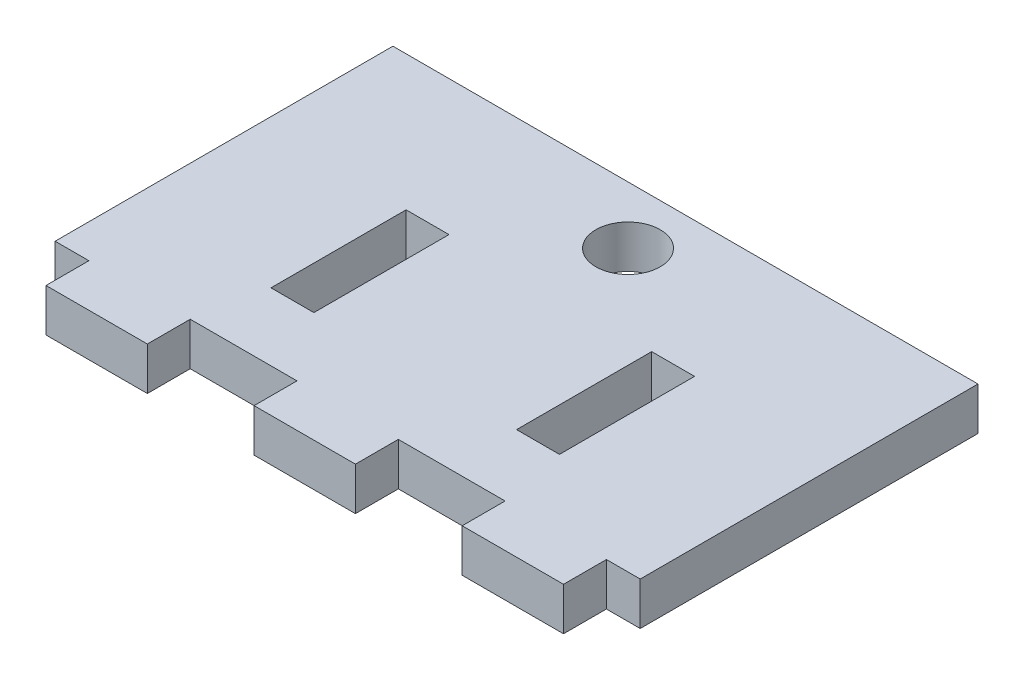
ISO-10303-21;
HEADER;
FILE_DESCRIPTION(('STEP AP214'),'2;1');
FILE_NAME('part.step','',(''),(''),'','','');
FILE_SCHEMA(('AUTOMOTIVE_DESIGN { 1 0 10303 214 1 1 1 1 }'));
ENDSEC;
DATA;
#1=APPLICATION_CONTEXT('core data for automotive mechanical design processes');
#2=APPLICATION_PROTOCOL_DEFINITION('international standard','automotive_design',2000,#1);
#3=PRODUCT_CONTEXT('',#1,'mechanical');
#4=PRODUCT('Part','Part','',(#3));
#5=PRODUCT_RELATED_PRODUCT_CATEGORY('part','',(#4));
#6=PRODUCT_DEFINITION_FORMATION('','',#4);
#7=PRODUCT_DEFINITION_CONTEXT('part definition',#1,'design');
#8=PRODUCT_DEFINITION('design','',#6,#7);
#9=PRODUCT_DEFINITION_SHAPE('','',#8);
#10=(LENGTH_UNIT() NAMED_UNIT(*) SI_UNIT(.MILLI.,.METRE.));
#11=(NAMED_UNIT(*) PLANE_ANGLE_UNIT() SI_UNIT($,.RADIAN.));
#12=(NAMED_UNIT(*) SI_UNIT($,.STERADIAN.) SOLID_ANGLE_UNIT());
#13=UNCERTAINTY_MEASURE_WITH_UNIT(LENGTH_MEASURE(1.E-05),#10,'distance_accuracy_value','');
#14=(GEOMETRIC_REPRESENTATION_CONTEXT(3) GLOBAL_UNCERTAINTY_ASSIGNED_CONTEXT((#13)) GLOBAL_UNIT_ASSIGNED_CONTEXT((#10,
#11,#12)) REPRESENTATION_CONTEXT('',''));
#15=CARTESIAN_POINT('',(0.,0.,0.));
#16=DIRECTION('',(0.,0.,1.));
#17=DIRECTION('',(1.,0.,0.));
#18=AXIS2_PLACEMENT_3D('',#15,#16,#17);
#19=CARTESIAN_POINT('',(-43.3012701892221,6.35,25.));
#20=DIRECTION('',(0.,0.,-1.));
#21=DIRECTION('',(-1.,0.,0.));
#22=AXIS2_PLACEMENT_3D('',#19,#20,#21);
#23=PLANE('',#22);
#24=DIRECTION('',(0.,1.,0.));
#25=VECTOR('',#24,1.);
#26=CARTESIAN_POINT('',(7.5,0.,25.));
#27=LINE('',#26,#25);
#28=CARTESIAN_POINT('',(7.5,0.,25.));
#29=VERTEX_POINT('',#28);
#30=CARTESIAN_POINT('',(7.5,6.35,25.));
#31=VERTEX_POINT('',#30);
#32=EDGE_CURVE('E246',#29,#31,#27,.T.);
#33=ORIENTED_EDGE('',*,*,#32,.F.);
#34=DIRECTION('',(1.,0.,0.));
#35=VECTOR('',#34,1.);
#36=CARTESIAN_POINT('',(-43.3012701892221,0.,25.));
#37=LINE('',#36,#35);
#38=CARTESIAN_POINT('',(23.3012701892221,0.,25.));
#39=VERTEX_POINT('',#38);
#40=EDGE_CURVE('E388',#29,#39,#37,.T.);
#41=ORIENTED_EDGE('',*,*,#40,.T.);
#42=DIRECTION('',(0.,-1.,0.));
#43=VECTOR('',#42,1.);
#44=CARTESIAN_POINT('',(23.3012701892221,0.,25.));
#45=LINE('',#44,#43);
#46=CARTESIAN_POINT('',(23.3012701892221,6.35,25.));
#47=VERTEX_POINT('',#46);
#48=EDGE_CURVE('E337',#47,#39,#45,.T.);
#49=ORIENTED_EDGE('',*,*,#48,.F.);
#50=DIRECTION('',(1.,0.,0.));
#51=VECTOR('',#50,1.);
#52=CARTESIAN_POINT('',(-43.3012701892221,6.35,25.));
#53=LINE('',#52,#51);
#54=EDGE_CURVE('E376',#31,#47,#53,.T.);
#55=ORIENTED_EDGE('',*,*,#54,.F.);
#56=EDGE_LOOP('',(#33,#41,#49,#55));
#57=FACE_BOUND('',#56,.T.);
#58=ADVANCED_FACE('F47',(#57),#23,.F.);
#59=DIRECTION('',(0.,-1.,0.));
#60=VECTOR('',#59,1.);
#61=CARTESIAN_POINT('',(-7.5,0.,25.));
#62=LINE('',#61,#60);
#63=CARTESIAN_POINT('',(-7.5,6.35,25.));
#64=VERTEX_POINT('',#63);
#65=CARTESIAN_POINT('',(-7.5,0.,25.));
#66=VERTEX_POINT('',#65);
#67=EDGE_CURVE('E283',#64,#66,#62,.T.);
#68=ORIENTED_EDGE('',*,*,#67,.F.);
#69=CARTESIAN_POINT('',(-23.3012701892221,6.35,25.));
#70=VERTEX_POINT('',#69);
#71=EDGE_CURVE('E375',#70,#64,#53,.T.);
#72=ORIENTED_EDGE('',*,*,#71,.F.);
#73=DIRECTION('',(0.,1.,0.));
#74=VECTOR('',#73,1.);
#75=CARTESIAN_POINT('',(-23.3012701892221,0.,25.));
#76=LINE('',#75,#74);
#77=CARTESIAN_POINT('',(-23.3012701892221,0.,25.));
#78=VERTEX_POINT('',#77);
#79=EDGE_CURVE('E310',#78,#70,#76,.T.);
#80=ORIENTED_EDGE('',*,*,#79,.F.);
#81=EDGE_CURVE('E387',#78,#66,#37,.T.);
#82=ORIENTED_EDGE('',*,*,#81,.T.);
#83=EDGE_LOOP('',(#68,#72,#80,#82));
#84=FACE_BOUND('',#83,.T.);
#85=ADVANCED_FACE('F452',(#84),#23,.F.);
#86=DIRECTION('',(0.,-1.,0.));
#87=VECTOR('',#86,1.);
#88=CARTESIAN_POINT('',(-38.3012701892221,0.,25.));
#89=LINE('',#88,#87);
#90=CARTESIAN_POINT('',(-38.3012701892221,6.35,25.));
#91=VERTEX_POINT('',#90);
#92=CARTESIAN_POINT('',(-38.3012701892221,0.,25.));
#93=VERTEX_POINT('',#92);
#94=EDGE_CURVE('E305',#91,#93,#89,.T.);
#95=ORIENTED_EDGE('',*,*,#94,.F.);
#96=CARTESIAN_POINT('',(-43.3012701892221,6.35,25.));
#97=VERTEX_POINT('',#96);
#98=EDGE_CURVE('E371',#97,#91,#53,.T.);
#99=ORIENTED_EDGE('',*,*,#98,.F.);
#100=DIRECTION('',(0.,-1.,0.));
#101=VECTOR('',#100,1.);
#102=CARTESIAN_POINT('',(-43.3012701892221,6.35,25.));
#103=LINE('',#102,#101);
#104=CARTESIAN_POINT('',(-43.3012701892221,0.,25.));
#105=VERTEX_POINT('',#104);
#106=EDGE_CURVE('E13',#97,#105,#103,.T.);
#107=ORIENTED_EDGE('',*,*,#106,.T.);
#108=EDGE_CURVE('E384',#105,#93,#37,.T.);
#109=ORIENTED_EDGE('',*,*,#108,.T.);
#110=EDGE_LOOP('',(#95,#99,#107,#109));
#111=FACE_BOUND('',#110,.T.);
#112=ADVANCED_FACE('F464',(#111),#23,.F.);
#113=DIRECTION('',(0.,1.,0.));
#114=VECTOR('',#113,1.);
#115=CARTESIAN_POINT('',(38.3012701892221,0.,25.));
#116=LINE('',#115,#114);
#117=CARTESIAN_POINT('',(38.3012701892221,0.,25.));
#118=VERTEX_POINT('',#117);
#119=CARTESIAN_POINT('',(38.3012701892221,6.35,25.));
#120=VERTEX_POINT('',#119);
#121=EDGE_CURVE('E332',#118,#120,#116,.T.);
#122=ORIENTED_EDGE('',*,*,#121,.F.);
#123=CARTESIAN_POINT('',(43.3012701892221,0.,25.));
#124=VERTEX_POINT('',#123);
#125=EDGE_CURVE('E383',#118,#124,#37,.T.);
#126=ORIENTED_EDGE('',*,*,#125,.T.);
#127=DIRECTION('',(0.,-1.,0.));
#128=VECTOR('',#127,1.);
#129=CARTESIAN_POINT('',(43.3012701892221,6.35,25.));
#130=LINE('',#129,#128);
#131=CARTESIAN_POINT('',(43.3012701892221,6.35,25.));
#132=VERTEX_POINT('',#131);
#133=EDGE_CURVE('E55',#132,#124,#130,.T.);
#134=ORIENTED_EDGE('',*,*,#133,.F.);
#135=EDGE_CURVE('E369',#120,#132,#53,.T.);
#136=ORIENTED_EDGE('',*,*,#135,.F.);
#137=EDGE_LOOP('',(#122,#126,#134,#136));
#138=FACE_BOUND('',#137,.T.);
#139=ADVANCED_FACE('F451',(#138),#23,.F.);
#140=CARTESIAN_POINT('',(-43.3012701892221,6.35,-25.));
#141=DIRECTION('',(1.,0.,0.));
#142=DIRECTION('',(0.,0.,-1.));
#143=AXIS2_PLACEMENT_3D('',#140,#141,#142);
#144=PLANE('',#143);
#145=DIRECTION('',(0.,0.,1.));
#146=VECTOR('',#145,1.);
#147=CARTESIAN_POINT('',(-43.3012701892221,0.,-25.));
#148=LINE('',#147,#146);
#149=CARTESIAN_POINT('',(-43.3012701892221,0.,-25.));
#150=VERTEX_POINT('',#149);
#151=EDGE_CURVE('E365',#150,#105,#148,.T.);
#152=ORIENTED_EDGE('',*,*,#151,.T.);
#153=ORIENTED_EDGE('',*,*,#106,.F.);
#154=DIRECTION('',(0.,0.,1.));
#155=VECTOR('',#154,1.);
#156=CARTESIAN_POINT('',(-43.3012701892221,6.35,-25.));
#157=LINE('',#156,#155);
#158=CARTESIAN_POINT('',(-43.3012701892221,6.35,-25.));
#159=VERTEX_POINT('',#158);
#160=EDGE_CURVE('E366',#159,#97,#157,.T.);
#161=ORIENTED_EDGE('',*,*,#160,.F.);
#162=DIRECTION('',(0.,-1.,0.));
#163=VECTOR('',#162,1.);
#164=CARTESIAN_POINT('',(-43.3012701892221,6.35,-25.));
#165=LINE('',#164,#163);
#166=EDGE_CURVE('E380',#159,#150,#165,.T.);
#167=ORIENTED_EDGE('',*,*,#166,.T.);
#168=EDGE_LOOP('',(#152,#153,#161,#167));
#169=FACE_BOUND('',#168,.T.);
#170=ADVANCED_FACE('F49',(#169),#144,.F.);
#171=CARTESIAN_POINT('',(43.3012701892221,6.35,-25.));
#172=DIRECTION('',(-1.,0.,0.));
#173=DIRECTION('',(0.,0.,1.));
#174=AXIS2_PLACEMENT_3D('',#171,#172,#173);
#175=PLANE('',#174);
#176=DIRECTION('',(0.,0.,-1.));
#177=VECTOR('',#176,1.);
#178=CARTESIAN_POINT('',(43.3012701892221,0.,-25.));
#179=LINE('',#178,#177);
#180=CARTESIAN_POINT('',(43.3012701892221,0.,-25.));
#181=VERTEX_POINT('',#180);
#182=EDGE_CURVE('E386',#124,#181,#179,.T.);
#183=ORIENTED_EDGE('',*,*,#182,.T.);
#184=DIRECTION('',(0.,-1.,0.));
#185=VECTOR('',#184,1.);
#186=CARTESIAN_POINT('',(43.3012701892221,6.35,-25.));
#187=LINE('',#186,#185);
#188=CARTESIAN_POINT('',(43.3012701892221,6.35,-25.));
#189=VERTEX_POINT('',#188);
#190=EDGE_CURVE('E393',#189,#181,#187,.T.);
#191=ORIENTED_EDGE('',*,*,#190,.F.);
#192=DIRECTION('',(0.,0.,-1.));
#193=VECTOR('',#192,1.);
#194=CARTESIAN_POINT('',(43.3012701892221,6.35,-25.));
#195=LINE('',#194,#193);
#196=EDGE_CURVE('E374',#132,#189,#195,.T.);
#197=ORIENTED_EDGE('',*,*,#196,.F.);
#198=ORIENTED_EDGE('',*,*,#133,.T.);
#199=EDGE_LOOP('',(#183,#191,#197,#198));
#200=FACE_BOUND('',#199,.T.);
#201=ADVANCED_FACE('F400',(#200),#175,.F.);
#202=CARTESIAN_POINT('',(-43.3012701892221,6.35,-25.));
#203=DIRECTION('',(0.,0.,1.));
#204=DIRECTION('',(1.,0.,0.));
#205=AXIS2_PLACEMENT_3D('',#202,#203,#204);
#206=PLANE('',#205);
#207=DIRECTION('',(-1.,0.,0.));
#208=VECTOR('',#207,1.);
#209=CARTESIAN_POINT('',(-43.3012701892221,0.,-25.));
#210=LINE('',#209,#208);
#211=EDGE_CURVE('E370',#181,#150,#210,.T.);
#212=ORIENTED_EDGE('',*,*,#211,.T.);
#213=ORIENTED_EDGE('',*,*,#166,.F.);
#214=DIRECTION('',(-1.,0.,0.));
#215=VECTOR('',#214,1.);
#216=CARTESIAN_POINT('',(-43.3012701892221,6.35,-25.));
#217=LINE('',#216,#215);
#218=EDGE_CURVE('E378',#189,#159,#217,.T.);
#219=ORIENTED_EDGE('',*,*,#218,.F.);
#220=ORIENTED_EDGE('',*,*,#190,.T.);
#221=EDGE_LOOP('',(#212,#213,#219,#220));
#222=FACE_BOUND('',#221,.T.);
#223=ADVANCED_FACE('F411',(#222),#206,.F.);
#224=CARTESIAN_POINT('',(0.,6.35,0.));
#225=DIRECTION('',(0.,1.,0.));
#226=DIRECTION('',(0.,0.,1.));
#227=AXIS2_PLACEMENT_3D('',#224,#225,#226);
#228=PLANE('',#227);
#229=DIRECTION('',(0.,0.,1.));
#230=VECTOR('',#229,1.);
#231=CARTESIAN_POINT('',(21.35,6.35,-5.00000000000002));
#232=LINE('',#231,#230);
#233=CARTESIAN_POINT('',(21.35,6.35,-5.00000000000002));
#234=VERTEX_POINT('',#233);
#235=CARTESIAN_POINT('',(21.35,6.35,15.));
#236=VERTEX_POINT('',#235);
#237=EDGE_CURVE('E212',#234,#236,#232,.T.);
#238=ORIENTED_EDGE('',*,*,#237,.T.);
#239=DIRECTION('',(-1.,0.,0.));
#240=VECTOR('',#239,1.);
#241=CARTESIAN_POINT('',(21.35,6.35,15.));
#242=LINE('',#241,#240);
#243=CARTESIAN_POINT('',(15.,6.35,15.));
#244=VERTEX_POINT('',#243);
#245=EDGE_CURVE('E223',#236,#244,#242,.T.);
#246=ORIENTED_EDGE('',*,*,#245,.T.);
#247=DIRECTION('',(0.,0.,-1.));
#248=VECTOR('',#247,1.);
#249=CARTESIAN_POINT('',(15.,6.35,-5.00000000000002));
#250=LINE('',#249,#248);
#251=CARTESIAN_POINT('',(15.,6.35,-5.00000000000002));
#252=VERTEX_POINT('',#251);
#253=EDGE_CURVE('E62',#244,#252,#250,.T.);
#254=ORIENTED_EDGE('',*,*,#253,.T.);
#255=DIRECTION('',(1.,0.,0.));
#256=VECTOR('',#255,1.);
#257=CARTESIAN_POINT('',(21.35,6.35,-5.00000000000002));
#258=LINE('',#257,#256);
#259=EDGE_CURVE('E220',#252,#234,#258,.T.);
#260=ORIENTED_EDGE('',*,*,#259,.T.);
#261=EDGE_LOOP('',(#238,#246,#254,#260));
#262=FACE_BOUND('',#261,.T.);
#263=DIRECTION('',(0.,0.,-1.));
#264=VECTOR('',#263,1.);
#265=CARTESIAN_POINT('',(-21.35,6.35,-5.00000000000002));
#266=LINE('',#265,#264);
#267=CARTESIAN_POINT('',(-21.35,6.35,15.));
#268=VERTEX_POINT('',#267);
#269=CARTESIAN_POINT('',(-21.35,6.35,-5.00000000000002));
#270=VERTEX_POINT('',#269);
#271=EDGE_CURVE('E250',#268,#270,#266,.T.);
#272=ORIENTED_EDGE('',*,*,#271,.T.);
#273=DIRECTION('',(1.,0.,0.));
#274=VECTOR('',#273,1.);
#275=CARTESIAN_POINT('',(-21.35,6.35,-5.00000000000002));
#276=LINE('',#275,#274);
#277=CARTESIAN_POINT('',(-15.,6.35,-5.00000000000002));
#278=VERTEX_POINT('',#277);
#279=EDGE_CURVE('E253',#270,#278,#276,.T.);
#280=ORIENTED_EDGE('',*,*,#279,.T.);
#281=DIRECTION('',(0.,0.,1.));
#282=VECTOR('',#281,1.);
#283=CARTESIAN_POINT('',(-15.,6.35,-5.00000000000002));
#284=LINE('',#283,#282);
#285=CARTESIAN_POINT('',(-15.,6.35,15.));
#286=VERTEX_POINT('',#285);
#287=EDGE_CURVE('E70',#278,#286,#284,.T.);
#288=ORIENTED_EDGE('',*,*,#287,.T.);
#289=DIRECTION('',(-1.,0.,0.));
#290=VECTOR('',#289,1.);
#291=CARTESIAN_POINT('',(-21.35,6.35,15.));
#292=LINE('',#291,#290);
#293=EDGE_CURVE('E258',#286,#268,#292,.T.);
#294=ORIENTED_EDGE('',*,*,#293,.T.);
#295=EDGE_LOOP('',(#272,#280,#288,#294));
#296=FACE_BOUND('',#295,.T.);
#297=CARTESIAN_POINT('',(0.,6.35,-16.5));
#298=DIRECTION('',(0.,1.,0.));
#299=DIRECTION('',(0.,0.,1.));
#300=AXIS2_PLACEMENT_3D('',#297,#298,#299);
#301=CIRCLE('',#300,4.7625);
#302=CARTESIAN_POINT('',(0.,6.35,-11.7375));
#303=VERTEX_POINT('',#302);
#304=EDGE_CURVE('E359',#303,#303,#301,.T.);
#305=ORIENTED_EDGE('',*,*,#304,.F.);
#306=EDGE_LOOP('',(#305));
#307=FACE_BOUND('',#306,.T.);
#308=ORIENTED_EDGE('',*,*,#160,.T.);
#309=ORIENTED_EDGE('',*,*,#98,.T.);
#310=DIRECTION('',(0.,0.,-1.));
#311=VECTOR('',#310,1.);
#312=CARTESIAN_POINT('',(-38.3012701892221,6.35,31.35));
#313=LINE('',#312,#311);
#314=CARTESIAN_POINT('',(-38.3012701892221,6.35,31.35));
#315=VERTEX_POINT('',#314);
#316=EDGE_CURVE('E316',#315,#91,#313,.T.);
#317=ORIENTED_EDGE('',*,*,#316,.F.);
#318=DIRECTION('',(-1.,0.,0.));
#319=VECTOR('',#318,1.);
#320=CARTESIAN_POINT('',(-38.3012701892221,6.35,31.35));
#321=LINE('',#320,#319);
#322=CARTESIAN_POINT('',(-23.3012701892221,6.35,31.35));
#323=VERTEX_POINT('',#322);
#324=EDGE_CURVE('E314',#323,#315,#321,.T.);
#325=ORIENTED_EDGE('',*,*,#324,.F.);
#326=DIRECTION('',(0.,0.,-1.));
#327=VECTOR('',#326,1.);
#328=CARTESIAN_POINT('',(-23.3012701892221,6.35,31.35));
#329=LINE('',#328,#327);
#330=EDGE_CURVE('E323',#323,#70,#329,.T.);
#331=ORIENTED_EDGE('',*,*,#330,.T.);
#332=ORIENTED_EDGE('',*,*,#71,.T.);
#333=DIRECTION('',(0.,0.,-1.));
#334=VECTOR('',#333,1.);
#335=CARTESIAN_POINT('',(-7.5,6.35,31.35));
#336=LINE('',#335,#334);
#337=CARTESIAN_POINT('',(-7.5,6.35,31.35));
#338=VERTEX_POINT('',#337);
#339=EDGE_CURVE('E299',#338,#64,#336,.T.);
#340=ORIENTED_EDGE('',*,*,#339,.F.);
#341=DIRECTION('',(-1.,0.,0.));
#342=VECTOR('',#341,1.);
#343=CARTESIAN_POINT('',(7.5,6.35,31.35));
#344=LINE('',#343,#342);
#345=CARTESIAN_POINT('',(7.5,6.35,31.35));
#346=VERTEX_POINT('',#345);
#347=EDGE_CURVE('E282',#346,#338,#344,.T.);
#348=ORIENTED_EDGE('',*,*,#347,.F.);
#349=DIRECTION('',(0.,0.,-1.));
#350=VECTOR('',#349,1.);
#351=CARTESIAN_POINT('',(7.5,6.35,31.35));
#352=LINE('',#351,#350);
#353=EDGE_CURVE('E302',#346,#31,#352,.T.);
#354=ORIENTED_EDGE('',*,*,#353,.T.);
#355=ORIENTED_EDGE('',*,*,#54,.T.);
#356=DIRECTION('',(0.,0.,-1.));
#357=VECTOR('',#356,1.);
#358=CARTESIAN_POINT('',(23.3012701892221,6.35,31.35));
#359=LINE('',#358,#357);
#360=CARTESIAN_POINT('',(23.3012701892221,6.35,31.35));
#361=VERTEX_POINT('',#360);
#362=EDGE_CURVE('E353',#361,#47,#359,.T.);
#363=ORIENTED_EDGE('',*,*,#362,.F.);
#364=DIRECTION('',(-1.,0.,0.));
#365=VECTOR('',#364,1.);
#366=CARTESIAN_POINT('',(38.3012701892221,6.35,31.35));
#367=LINE('',#366,#365);
#368=CARTESIAN_POINT('',(38.3012701892221,6.35,31.35));
#369=VERTEX_POINT('',#368);
#370=EDGE_CURVE('E336',#369,#361,#367,.T.);
#371=ORIENTED_EDGE('',*,*,#370,.F.);
#372=DIRECTION('',(0.,0.,-1.));
#373=VECTOR('',#372,1.);
#374=CARTESIAN_POINT('',(38.3012701892221,6.35,31.35));
#375=LINE('',#374,#373);
#376=EDGE_CURVE('E356',#369,#120,#375,.T.);
#377=ORIENTED_EDGE('',*,*,#376,.T.);
#378=ORIENTED_EDGE('',*,*,#135,.T.);
#379=ORIENTED_EDGE('',*,*,#196,.T.);
#380=ORIENTED_EDGE('',*,*,#218,.T.);
#381=EDGE_LOOP('',(#308,#309,#317,#325,#331,#332,#340,#348,#354,#355,#363,#371,#377,#378,#379,#380));
#382=FACE_BOUND('',#381,.T.);
#383=ADVANCED_FACE('F227',(#262,#296,#307,#382),#228,.T.);
#384=CARTESIAN_POINT('',(0.,0.,0.));
#385=DIRECTION('',(0.,1.,0.));
#386=DIRECTION('',(0.,0.,1.));
#387=AXIS2_PLACEMENT_3D('',#384,#385,#386);
#388=PLANE('',#387);
#389=DIRECTION('',(-1.,0.,0.));
#390=VECTOR('',#389,1.);
#391=CARTESIAN_POINT('',(21.35,0.,15.));
#392=LINE('',#391,#390);
#393=CARTESIAN_POINT('',(21.35,0.,15.));
#394=VERTEX_POINT('',#393);
#395=CARTESIAN_POINT('',(15.,0.,15.));
#396=VERTEX_POINT('',#395);
#397=EDGE_CURVE('E239',#394,#396,#392,.T.);
#398=ORIENTED_EDGE('',*,*,#397,.F.);
#399=DIRECTION('',(0.,0.,1.));
#400=VECTOR('',#399,1.);
#401=CARTESIAN_POINT('',(21.35,0.,-5.00000000000002));
#402=LINE('',#401,#400);
#403=CARTESIAN_POINT('',(21.35,0.,-5.00000000000002));
#404=VERTEX_POINT('',#403);
#405=EDGE_CURVE('E215',#404,#394,#402,.T.);
#406=ORIENTED_EDGE('',*,*,#405,.F.);
#407=DIRECTION('',(1.,0.,0.));
#408=VECTOR('',#407,1.);
#409=CARTESIAN_POINT('',(21.35,0.,-5.00000000000002));
#410=LINE('',#409,#408);
#411=CARTESIAN_POINT('',(15.,0.,-5.00000000000002));
#412=VERTEX_POINT('',#411);
#413=EDGE_CURVE('E230',#412,#404,#410,.T.);
#414=ORIENTED_EDGE('',*,*,#413,.F.);
#415=DIRECTION('',(0.,0.,-1.));
#416=VECTOR('',#415,1.);
#417=CARTESIAN_POINT('',(15.,0.,-5.00000000000002));
#418=LINE('',#417,#416);
#419=EDGE_CURVE('E233',#396,#412,#418,.T.);
#420=ORIENTED_EDGE('',*,*,#419,.F.);
#421=EDGE_LOOP('',(#398,#406,#414,#420));
#422=FACE_BOUND('',#421,.T.);
#423=DIRECTION('',(1.,0.,0.));
#424=VECTOR('',#423,1.);
#425=CARTESIAN_POINT('',(-21.35,0.,-5.00000000000002));
#426=LINE('',#425,#424);
#427=CARTESIAN_POINT('',(-21.35,0.,-5.00000000000002));
#428=VERTEX_POINT('',#427);
#429=CARTESIAN_POINT('',(-15.,0.,-5.00000000000002));
#430=VERTEX_POINT('',#429);
#431=EDGE_CURVE('E264',#428,#430,#426,.T.);
#432=ORIENTED_EDGE('',*,*,#431,.F.);
#433=DIRECTION('',(0.,0.,-1.));
#434=VECTOR('',#433,1.);
#435=CARTESIAN_POINT('',(-21.35,0.,-5.00000000000002));
#436=LINE('',#435,#434);
#437=CARTESIAN_POINT('',(-21.35,0.,15.));
#438=VERTEX_POINT('',#437);
#439=EDGE_CURVE('E262',#438,#428,#436,.T.);
#440=ORIENTED_EDGE('',*,*,#439,.F.);
#441=DIRECTION('',(-1.,0.,0.));
#442=VECTOR('',#441,1.);
#443=CARTESIAN_POINT('',(-21.35,0.,15.));
#444=LINE('',#443,#442);
#445=CARTESIAN_POINT('',(-15.,0.,15.));
#446=VERTEX_POINT('',#445);
#447=EDGE_CURVE('E254',#446,#438,#444,.T.);
#448=ORIENTED_EDGE('',*,*,#447,.F.);
#449=DIRECTION('',(0.,0.,1.));
#450=VECTOR('',#449,1.);
#451=CARTESIAN_POINT('',(-15.,0.,-5.00000000000002));
#452=LINE('',#451,#450);
#453=EDGE_CURVE('E267',#430,#446,#452,.T.);
#454=ORIENTED_EDGE('',*,*,#453,.F.);
#455=EDGE_LOOP('',(#432,#440,#448,#454));
#456=FACE_BOUND('',#455,.T.);
#457=CARTESIAN_POINT('',(0.,0.,-16.5));
#458=DIRECTION('',(0.,1.,0.));
#459=DIRECTION('',(0.,0.,1.));
#460=AXIS2_PLACEMENT_3D('',#457,#458,#459);
#461=CIRCLE('',#460,4.7625);
#462=CARTESIAN_POINT('',(0.,0.,-11.7375));
#463=VERTEX_POINT('',#462);
#464=EDGE_CURVE('E362',#463,#463,#461,.F.);
#465=ORIENTED_EDGE('',*,*,#464,.F.);
#466=EDGE_LOOP('',(#465));
#467=FACE_BOUND('',#466,.T.);
#468=ORIENTED_EDGE('',*,*,#151,.F.);
#469=ORIENTED_EDGE('',*,*,#211,.F.);
#470=ORIENTED_EDGE('',*,*,#182,.F.);
#471=ORIENTED_EDGE('',*,*,#125,.F.);
#472=DIRECTION('',(0.,0.,-1.));
#473=VECTOR('',#472,1.);
#474=CARTESIAN_POINT('',(38.3012701892221,0.,31.35));
#475=LINE('',#474,#473);
#476=CARTESIAN_POINT('',(38.3012701892221,0.,31.35));
#477=VERTEX_POINT('',#476);
#478=EDGE_CURVE('E343',#477,#118,#475,.T.);
#479=ORIENTED_EDGE('',*,*,#478,.F.);
#480=DIRECTION('',(1.,0.,0.));
#481=VECTOR('',#480,1.);
#482=CARTESIAN_POINT('',(38.3012701892221,0.,31.35));
#483=LINE('',#482,#481);
#484=CARTESIAN_POINT('',(23.3012701892221,0.,31.35));
#485=VERTEX_POINT('',#484);
#486=EDGE_CURVE('E341',#485,#477,#483,.T.);
#487=ORIENTED_EDGE('',*,*,#486,.F.);
#488=DIRECTION('',(0.,0.,-1.));
#489=VECTOR('',#488,1.);
#490=CARTESIAN_POINT('',(23.3012701892221,0.,31.35));
#491=LINE('',#490,#489);
#492=EDGE_CURVE('E350',#485,#39,#491,.T.);
#493=ORIENTED_EDGE('',*,*,#492,.T.);
#494=ORIENTED_EDGE('',*,*,#40,.F.);
#495=DIRECTION('',(0.,0.,-1.));
#496=VECTOR('',#495,1.);
#497=CARTESIAN_POINT('',(7.5,0.,31.35));
#498=LINE('',#497,#496);
#499=CARTESIAN_POINT('',(7.5,0.,31.35));
#500=VERTEX_POINT('',#499);
#501=EDGE_CURVE('E289',#500,#29,#498,.T.);
#502=ORIENTED_EDGE('',*,*,#501,.F.);
#503=DIRECTION('',(1.,0.,0.));
#504=VECTOR('',#503,1.);
#505=CARTESIAN_POINT('',(7.5,0.,31.35));
#506=LINE('',#505,#504);
#507=CARTESIAN_POINT('',(-7.5,0.,31.35));
#508=VERTEX_POINT('',#507);
#509=EDGE_CURVE('E287',#508,#500,#506,.T.);
#510=ORIENTED_EDGE('',*,*,#509,.F.);
#511=DIRECTION('',(0.,0.,-1.));
#512=VECTOR('',#511,1.);
#513=CARTESIAN_POINT('',(-7.5,0.,31.35));
#514=LINE('',#513,#512);
#515=EDGE_CURVE('E296',#508,#66,#514,.T.);
#516=ORIENTED_EDGE('',*,*,#515,.T.);
#517=ORIENTED_EDGE('',*,*,#81,.F.);
#518=DIRECTION('',(0.,0.,-1.));
#519=VECTOR('',#518,1.);
#520=CARTESIAN_POINT('',(-23.3012701892221,0.,31.35));
#521=LINE('',#520,#519);
#522=CARTESIAN_POINT('',(-23.3012701892221,0.,31.35));
#523=VERTEX_POINT('',#522);
#524=EDGE_CURVE('E326',#523,#78,#521,.T.);
#525=ORIENTED_EDGE('',*,*,#524,.F.);
#526=DIRECTION('',(1.,0.,0.));
#527=VECTOR('',#526,1.);
#528=CARTESIAN_POINT('',(-38.3012701892221,0.,31.35));
#529=LINE('',#528,#527);
#530=CARTESIAN_POINT('',(-38.3012701892221,0.,31.35));
#531=VERTEX_POINT('',#530);
#532=EDGE_CURVE('E309',#531,#523,#529,.T.);
#533=ORIENTED_EDGE('',*,*,#532,.F.);
#534=DIRECTION('',(0.,0.,-1.));
#535=VECTOR('',#534,1.);
#536=CARTESIAN_POINT('',(-38.3012701892221,0.,31.35));
#537=LINE('',#536,#535);
#538=EDGE_CURVE('E329',#531,#93,#537,.T.);
#539=ORIENTED_EDGE('',*,*,#538,.T.);
#540=ORIENTED_EDGE('',*,*,#108,.F.);
#541=EDGE_LOOP('',(#468,#469,#470,#471,#479,#487,#493,#494,#502,#510,#516,#517,#525,#533,#539,#540));
#542=FACE_BOUND('',#541,.T.);
#543=ADVANCED_FACE('F407',(#422,#456,#467,#542),#388,.F.);
#544=CARTESIAN_POINT('',(0.,-13.4703841816037,-16.5));
#545=DIRECTION('',(0.,1.,0.));
#546=DIRECTION('',(0.,0.,1.));
#547=AXIS2_PLACEMENT_3D('',#544,#545,#546);
#548=CYLINDRICAL_SURFACE('',#547,4.7625);
#549=ORIENTED_EDGE('',*,*,#464,.T.);
#550=EDGE_LOOP('',(#549));
#551=FACE_BOUND('',#550,.T.);
#552=ORIENTED_EDGE('',*,*,#304,.T.);
#553=EDGE_LOOP('',(#552));
#554=FACE_BOUND('',#553,.T.);
#555=ADVANCED_FACE('F480',(#551,#554),#548,.F.);
#556=CARTESIAN_POINT('',(38.3012701892221,0.,31.35));
#557=DIRECTION('',(-1.,0.,0.));
#558=DIRECTION('',(0.,0.,1.));
#559=AXIS2_PLACEMENT_3D('',#556,#557,#558);
#560=PLANE('',#559);
#561=ORIENTED_EDGE('',*,*,#121,.T.);
#562=ORIENTED_EDGE('',*,*,#376,.F.);
#563=DIRECTION('',(0.,1.,0.));
#564=VECTOR('',#563,1.);
#565=CARTESIAN_POINT('',(38.3012701892221,0.,31.35));
#566=LINE('',#565,#564);
#567=EDGE_CURVE('E333',#477,#369,#566,.T.);
#568=ORIENTED_EDGE('',*,*,#567,.F.);
#569=ORIENTED_EDGE('',*,*,#478,.T.);
#570=EDGE_LOOP('',(#561,#562,#568,#569));
#571=FACE_BOUND('',#570,.T.);
#572=ADVANCED_FACE('F450',(#571),#560,.F.);
#573=CARTESIAN_POINT('',(23.3012701892221,0.,31.35));
#574=DIRECTION('',(1.,0.,0.));
#575=DIRECTION('',(0.,1.,0.));
#576=AXIS2_PLACEMENT_3D('',#573,#574,#575);
#577=PLANE('',#576);
#578=ORIENTED_EDGE('',*,*,#48,.T.);
#579=ORIENTED_EDGE('',*,*,#492,.F.);
#580=DIRECTION('',(0.,-1.,0.));
#581=VECTOR('',#580,1.);
#582=CARTESIAN_POINT('',(23.3012701892221,0.,31.35));
#583=LINE('',#582,#581);
#584=EDGE_CURVE('E339',#361,#485,#583,.T.);
#585=ORIENTED_EDGE('',*,*,#584,.F.);
#586=ORIENTED_EDGE('',*,*,#362,.T.);
#587=EDGE_LOOP('',(#578,#579,#585,#586));
#588=FACE_BOUND('',#587,.T.);
#589=ADVANCED_FACE('F444',(#588),#577,.F.);
#590=CARTESIAN_POINT('',(0.,0.,31.35));
#591=DIRECTION('',(0.,0.,1.));
#592=DIRECTION('',(1.,0.,0.));
#593=AXIS2_PLACEMENT_3D('',#590,#591,#592);
#594=PLANE('',#593);
#595=ORIENTED_EDGE('',*,*,#567,.T.);
#596=ORIENTED_EDGE('',*,*,#370,.T.);
#597=ORIENTED_EDGE('',*,*,#584,.T.);
#598=ORIENTED_EDGE('',*,*,#486,.T.);
#599=EDGE_LOOP('',(#595,#596,#597,#598));
#600=FACE_BOUND('',#599,.T.);
#601=ADVANCED_FACE('F447',(#600),#594,.T.);
#602=CARTESIAN_POINT('',(-38.3012701892221,0.,31.35));
#603=DIRECTION('',(1.,0.,0.));
#604=DIRECTION('',(0.,0.,-1.));
#605=AXIS2_PLACEMENT_3D('',#602,#603,#604);
#606=PLANE('',#605);
#607=ORIENTED_EDGE('',*,*,#94,.T.);
#608=ORIENTED_EDGE('',*,*,#538,.F.);
#609=DIRECTION('',(0.,-1.,0.));
#610=VECTOR('',#609,1.);
#611=CARTESIAN_POINT('',(-38.3012701892221,0.,31.35));
#612=LINE('',#611,#610);
#613=EDGE_CURVE('E306',#315,#531,#612,.T.);
#614=ORIENTED_EDGE('',*,*,#613,.F.);
#615=ORIENTED_EDGE('',*,*,#316,.T.);
#616=EDGE_LOOP('',(#607,#608,#614,#615));
#617=FACE_BOUND('',#616,.T.);
#618=ADVANCED_FACE('F462',(#617),#606,.F.);
#619=CARTESIAN_POINT('',(-23.3012701892221,0.,31.35));
#620=DIRECTION('',(-1.,0.,0.));
#621=DIRECTION('',(0.,0.,1.));
#622=AXIS2_PLACEMENT_3D('',#619,#620,#621);
#623=PLANE('',#622);
#624=ORIENTED_EDGE('',*,*,#79,.T.);
#625=ORIENTED_EDGE('',*,*,#330,.F.);
#626=DIRECTION('',(0.,1.,0.));
#627=VECTOR('',#626,1.);
#628=CARTESIAN_POINT('',(-23.3012701892221,0.,31.35));
#629=LINE('',#628,#627);
#630=EDGE_CURVE('E312',#523,#323,#629,.T.);
#631=ORIENTED_EDGE('',*,*,#630,.F.);
#632=ORIENTED_EDGE('',*,*,#524,.T.);
#633=EDGE_LOOP('',(#624,#625,#631,#632));
#634=FACE_BOUND('',#633,.T.);
#635=ADVANCED_FACE('F456',(#634),#623,.F.);
#636=CARTESIAN_POINT('',(0.,0.,31.35));
#637=DIRECTION('',(0.,0.,-1.));
#638=DIRECTION('',(-1.,0.,0.));
#639=AXIS2_PLACEMENT_3D('',#636,#637,#638);
#640=PLANE('',#639);
#641=ORIENTED_EDGE('',*,*,#613,.T.);
#642=ORIENTED_EDGE('',*,*,#532,.T.);
#643=ORIENTED_EDGE('',*,*,#630,.T.);
#644=ORIENTED_EDGE('',*,*,#324,.T.);
#645=EDGE_LOOP('',(#641,#642,#643,#644));
#646=FACE_BOUND('',#645,.T.);
#647=ADVANCED_FACE('F458',(#646),#640,.F.);
#648=CARTESIAN_POINT('',(7.5,0.,31.35));
#649=DIRECTION('',(-1.,0.,0.));
#650=DIRECTION('',(0.,-1.,0.));
#651=AXIS2_PLACEMENT_3D('',#648,#649,#650);
#652=PLANE('',#651);
#653=ORIENTED_EDGE('',*,*,#32,.T.);
#654=ORIENTED_EDGE('',*,*,#353,.F.);
#655=DIRECTION('',(0.,1.,0.));
#656=VECTOR('',#655,1.);
#657=CARTESIAN_POINT('',(7.5,0.,31.35));
#658=LINE('',#657,#656);
#659=EDGE_CURVE('E279',#500,#346,#658,.T.);
#660=ORIENTED_EDGE('',*,*,#659,.F.);
#661=ORIENTED_EDGE('',*,*,#501,.T.);
#662=EDGE_LOOP('',(#653,#654,#660,#661));
#663=FACE_BOUND('',#662,.T.);
#664=ADVANCED_FACE('F439',(#663),#652,.F.);
#665=CARTESIAN_POINT('',(-7.5,0.,31.35));
#666=DIRECTION('',(1.,0.,0.));
#667=DIRECTION('',(0.,0.,-1.));
#668=AXIS2_PLACEMENT_3D('',#665,#666,#667);
#669=PLANE('',#668);
#670=ORIENTED_EDGE('',*,*,#67,.T.);
#671=ORIENTED_EDGE('',*,*,#515,.F.);
#672=DIRECTION('',(0.,-1.,0.));
#673=VECTOR('',#672,1.);
#674=CARTESIAN_POINT('',(-7.5,0.,31.35));
#675=LINE('',#674,#673);
#676=EDGE_CURVE('E285',#338,#508,#675,.T.);
#677=ORIENTED_EDGE('',*,*,#676,.F.);
#678=ORIENTED_EDGE('',*,*,#339,.T.);
#679=EDGE_LOOP('',(#670,#671,#677,#678));
#680=FACE_BOUND('',#679,.T.);
#681=ADVANCED_FACE('F427',(#680),#669,.F.);
#682=CARTESIAN_POINT('',(0.,0.,31.35));
#683=DIRECTION('',(0.,0.,1.));
#684=DIRECTION('',(1.,0.,0.));
#685=AXIS2_PLACEMENT_3D('',#682,#683,#684);
#686=PLANE('',#685);
#687=ORIENTED_EDGE('',*,*,#659,.T.);
#688=ORIENTED_EDGE('',*,*,#347,.T.);
#689=ORIENTED_EDGE('',*,*,#676,.T.);
#690=ORIENTED_EDGE('',*,*,#509,.T.);
#691=EDGE_LOOP('',(#687,#688,#689,#690));
#692=FACE_BOUND('',#691,.T.);
#693=ADVANCED_FACE('F431',(#692),#686,.T.);
#694=CARTESIAN_POINT('',(-21.35,6.35,-5.00000000000002));
#695=DIRECTION('',(-1.,0.,0.));
#696=DIRECTION('',(0.,0.,1.));
#697=AXIS2_PLACEMENT_3D('',#694,#695,#696);
#698=PLANE('',#697);
#699=ORIENTED_EDGE('',*,*,#439,.T.);
#700=DIRECTION('',(0.,-1.,0.));
#701=VECTOR('',#700,1.);
#702=CARTESIAN_POINT('',(-21.35,6.35,-5.00000000000002));
#703=LINE('',#702,#701);
#704=EDGE_CURVE('E261',#270,#428,#703,.T.);
#705=ORIENTED_EDGE('',*,*,#704,.F.);
#706=ORIENTED_EDGE('',*,*,#271,.F.);
#707=DIRECTION('',(0.,-1.,0.));
#708=VECTOR('',#707,1.);
#709=CARTESIAN_POINT('',(-21.35,6.35,15.));
#710=LINE('',#709,#708);
#711=EDGE_CURVE('E240',#268,#438,#710,.T.);
#712=ORIENTED_EDGE('',*,*,#711,.T.);
#713=EDGE_LOOP('',(#699,#705,#706,#712));
#714=FACE_BOUND('',#713,.T.);
#715=ADVANCED_FACE('F565',(#714),#698,.F.);
#716=CARTESIAN_POINT('',(-21.35,6.35,15.));
#717=DIRECTION('',(0.,0.,1.));
#718=DIRECTION('',(1.,0.,0.));
#719=AXIS2_PLACEMENT_3D('',#716,#717,#718);
#720=PLANE('',#719);
#721=ORIENTED_EDGE('',*,*,#447,.T.);
#722=ORIENTED_EDGE('',*,*,#711,.F.);
#723=ORIENTED_EDGE('',*,*,#293,.F.);
#724=DIRECTION('',(0.,-1.,0.));
#725=VECTOR('',#724,1.);
#726=CARTESIAN_POINT('',(-15.,6.35,15.));
#727=LINE('',#726,#725);
#728=EDGE_CURVE('E273',#286,#446,#727,.T.);
#729=ORIENTED_EDGE('',*,*,#728,.T.);
#730=EDGE_LOOP('',(#721,#722,#723,#729));
#731=FACE_BOUND('',#730,.T.);
#732=ADVANCED_FACE('F568',(#731),#720,.F.);
#733=CARTESIAN_POINT('',(-15.,6.35,-5.00000000000002));
#734=DIRECTION('',(1.,0.,0.));
#735=DIRECTION('',(0.,0.,-1.));
#736=AXIS2_PLACEMENT_3D('',#733,#734,#735);
#737=PLANE('',#736);
#738=ORIENTED_EDGE('',*,*,#453,.T.);
#739=ORIENTED_EDGE('',*,*,#728,.F.);
#740=ORIENTED_EDGE('',*,*,#287,.F.);
#741=DIRECTION('',(0.,-1.,0.));
#742=VECTOR('',#741,1.);
#743=CARTESIAN_POINT('',(-15.,6.35,-5.00000000000002));
#744=LINE('',#743,#742);
#745=EDGE_CURVE('E275',#278,#430,#744,.T.);
#746=ORIENTED_EDGE('',*,*,#745,.T.);
#747=EDGE_LOOP('',(#738,#739,#740,#746));
#748=FACE_BOUND('',#747,.T.);
#749=ADVANCED_FACE('F573',(#748),#737,.F.);
#750=CARTESIAN_POINT('',(-21.35,6.35,-5.00000000000002));
#751=DIRECTION('',(0.,0.,-1.));
#752=DIRECTION('',(-1.,0.,0.));
#753=AXIS2_PLACEMENT_3D('',#750,#751,#752);
#754=PLANE('',#753);
#755=ORIENTED_EDGE('',*,*,#431,.T.);
#756=ORIENTED_EDGE('',*,*,#745,.F.);
#757=ORIENTED_EDGE('',*,*,#279,.F.);
#758=ORIENTED_EDGE('',*,*,#704,.T.);
#759=EDGE_LOOP('',(#755,#756,#757,#758));
#760=FACE_BOUND('',#759,.T.);
#761=ADVANCED_FACE('F570',(#760),#754,.F.);
#762=CARTESIAN_POINT('',(21.35,6.35,-5.00000000000002));
#763=DIRECTION('',(1.,0.,0.));
#764=DIRECTION('',(0.,0.,-1.));
#765=AXIS2_PLACEMENT_3D('',#762,#763,#764);
#766=PLANE('',#765);
#767=ORIENTED_EDGE('',*,*,#405,.T.);
#768=DIRECTION('',(0.,-1.,0.));
#769=VECTOR('',#768,1.);
#770=CARTESIAN_POINT('',(21.35,6.35,15.));
#771=LINE('',#770,#769);
#772=EDGE_CURVE('E208',#236,#394,#771,.T.);
#773=ORIENTED_EDGE('',*,*,#772,.F.);
#774=ORIENTED_EDGE('',*,*,#237,.F.);
#775=DIRECTION('',(0.,-1.,0.));
#776=VECTOR('',#775,1.);
#777=CARTESIAN_POINT('',(21.35,6.35,-5.00000000000002));
#778=LINE('',#777,#776);
#779=EDGE_CURVE('E244',#234,#404,#778,.T.);
#780=ORIENTED_EDGE('',*,*,#779,.T.);
#781=EDGE_LOOP('',(#767,#773,#774,#780));
#782=FACE_BOUND('',#781,.T.);
#783=ADVANCED_FACE('F210',(#782),#766,.F.);
#784=CARTESIAN_POINT('',(21.35,6.35,-5.00000000000002));
#785=DIRECTION('',(0.,0.,-1.));
#786=DIRECTION('',(-1.,0.,0.));
#787=AXIS2_PLACEMENT_3D('',#784,#785,#786);
#788=PLANE('',#787);
#789=ORIENTED_EDGE('',*,*,#413,.T.);
#790=ORIENTED_EDGE('',*,*,#779,.F.);
#791=ORIENTED_EDGE('',*,*,#259,.F.);
#792=DIRECTION('',(0.,-1.,0.));
#793=VECTOR('',#792,1.);
#794=CARTESIAN_POINT('',(15.,6.35,-5.00000000000002));
#795=LINE('',#794,#793);
#796=EDGE_CURVE('E247',#252,#412,#795,.T.);
#797=ORIENTED_EDGE('',*,*,#796,.T.);
#798=EDGE_LOOP('',(#789,#790,#791,#797));
#799=FACE_BOUND('',#798,.T.);
#800=ADVANCED_FACE('F582',(#799),#788,.F.);
#801=CARTESIAN_POINT('',(15.,6.35,-5.00000000000002));
#802=DIRECTION('',(-1.,0.,0.));
#803=DIRECTION('',(0.,0.,1.));
#804=AXIS2_PLACEMENT_3D('',#801,#802,#803);
#805=PLANE('',#804);
#806=ORIENTED_EDGE('',*,*,#419,.T.);
#807=ORIENTED_EDGE('',*,*,#796,.F.);
#808=ORIENTED_EDGE('',*,*,#253,.F.);
#809=DIRECTION('',(0.,-1.,0.));
#810=VECTOR('',#809,1.);
#811=CARTESIAN_POINT('',(15.,6.35,15.));
#812=LINE('',#811,#810);
#813=EDGE_CURVE('E219',#244,#396,#812,.T.);
#814=ORIENTED_EDGE('',*,*,#813,.T.);
#815=EDGE_LOOP('',(#806,#807,#808,#814));
#816=FACE_BOUND('',#815,.T.);
#817=ADVANCED_FACE('F585',(#816),#805,.F.);
#818=CARTESIAN_POINT('',(21.35,6.35,15.));
#819=DIRECTION('',(0.,0.,1.));
#820=DIRECTION('',(1.,0.,0.));
#821=AXIS2_PLACEMENT_3D('',#818,#819,#820);
#822=PLANE('',#821);
#823=ORIENTED_EDGE('',*,*,#397,.T.);
#824=ORIENTED_EDGE('',*,*,#813,.F.);
#825=ORIENTED_EDGE('',*,*,#245,.F.);
#826=ORIENTED_EDGE('',*,*,#772,.T.);
#827=EDGE_LOOP('',(#823,#824,#825,#826));
#828=FACE_BOUND('',#827,.T.);
#829=ADVANCED_FACE('F224',(#828),#822,.F.);
#830=CLOSED_SHELL('',(#58,#85,#112,#139,#170,#201,#223,#383,#543,#555,#572,#589,#601,#618,#635,
#647,#664,#681,#693,#715,#732,#749,#761,#783,#800,#817,#829));
#831=MANIFOLD_SOLID_BREP('B2',#830);
#832=ADVANCED_BREP_SHAPE_REPRESENTATION('',(#18,#831),#14);
#833=SHAPE_DEFINITION_REPRESENTATION(#9,#832);
ENDSEC;
END-ISO-10303-21;
